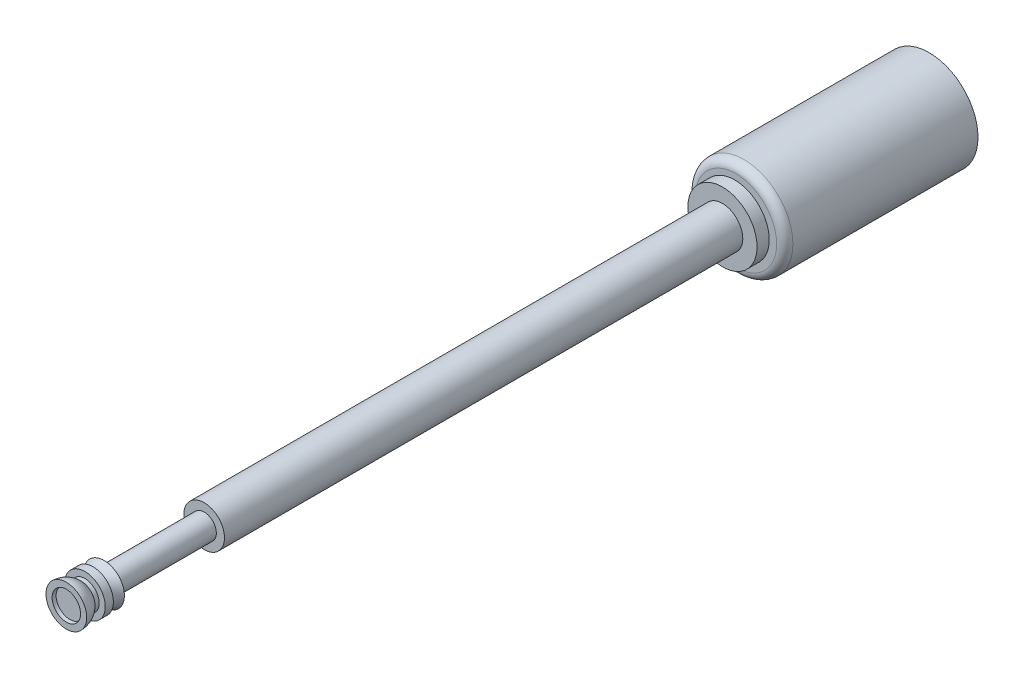
ISO-10303-21;
HEADER;
FILE_DESCRIPTION(('STEP AP214'),'2;1');
FILE_NAME('part.step','',(''),(''),'','','');
FILE_SCHEMA(('AUTOMOTIVE_DESIGN { 1 0 10303 214 1 1 1 1 }'));
ENDSEC;
DATA;
#1=APPLICATION_CONTEXT('core data for automotive mechanical design processes');
#2=APPLICATION_PROTOCOL_DEFINITION('international standard','automotive_design',2000,#1);
#3=PRODUCT_CONTEXT('',#1,'mechanical');
#4=PRODUCT('Part','Part','',(#3));
#5=PRODUCT_RELATED_PRODUCT_CATEGORY('part','',(#4));
#6=PRODUCT_DEFINITION_FORMATION('','',#4);
#7=PRODUCT_DEFINITION_CONTEXT('part definition',#1,'design');
#8=PRODUCT_DEFINITION('design','',#6,#7);
#9=PRODUCT_DEFINITION_SHAPE('','',#8);
#10=(LENGTH_UNIT() NAMED_UNIT(*) SI_UNIT(.MILLI.,.METRE.));
#11=(NAMED_UNIT(*) PLANE_ANGLE_UNIT() SI_UNIT($,.RADIAN.));
#12=(NAMED_UNIT(*) SI_UNIT($,.STERADIAN.) SOLID_ANGLE_UNIT());
#13=UNCERTAINTY_MEASURE_WITH_UNIT(LENGTH_MEASURE(1.E-05),#10,'distance_accuracy_value','');
#14=(GEOMETRIC_REPRESENTATION_CONTEXT(3) GLOBAL_UNCERTAINTY_ASSIGNED_CONTEXT((#13)) GLOBAL_UNIT_ASSIGNED_CONTEXT((#10,
#11,#12)) REPRESENTATION_CONTEXT('',''));
#15=CARTESIAN_POINT('',(0.,0.,0.));
#16=DIRECTION('',(0.,0.,1.));
#17=DIRECTION('',(1.,0.,0.));
#18=AXIS2_PLACEMENT_3D('',#15,#16,#17);
#19=CARTESIAN_POINT('',(0.,0.,16.4275));
#20=DIRECTION('',(0.,0.,-1.));
#21=DIRECTION('',(-1.,0.,0.));
#22=AXIS2_PLACEMENT_3D('',#19,#20,#21);
#23=SPHERICAL_SURFACE('',#22,0.35);
#24=CARTESIAN_POINT('',(0.,0.,16.4275));
#25=DIRECTION('',(0.,0.,-1.));
#26=DIRECTION('',(-1.,0.,0.));
#27=AXIS2_PLACEMENT_3D('',#24,#25,#26);
#28=CIRCLE('',#27,0.35);
#29=CARTESIAN_POINT('',(-0.35,0.,16.4275));
#30=VERTEX_POINT('',#29);
#31=EDGE_CURVE('E87',#30,#30,#28,.T.);
#32=ORIENTED_EDGE('',*,*,#31,.F.);
#33=EDGE_LOOP('',(#32));
#34=FACE_BOUND('',#33,.T.);
#35=CARTESIAN_POINT('',(0.,0.,16.34));
#36=DIRECTION('',(0.,0.,-1.));
#37=DIRECTION('',(-1.,0.,0.));
#38=AXIS2_PLACEMENT_3D('',#35,#36,#37);
#39=CIRCLE('',#38,0.338886042793148);
#40=CARTESIAN_POINT('',(-0.338886042793148,0.,16.34));
#41=VERTEX_POINT('',#40);
#42=EDGE_CURVE('E10',#41,#41,#39,.F.);
#43=ORIENTED_EDGE('',*,*,#42,.F.);
#44=EDGE_LOOP('',(#43));
#45=FACE_BOUND('',#44,.T.);
#46=ADVANCED_FACE('F36',(#34,#45),#23,.F.);
#47=CARTESIAN_POINT('',(0.,0.,15.8012648671457));
#48=DIRECTION('',(0.,0.,-1.));
#49=DIRECTION('',(-1.,0.,0.));
#50=AXIS2_PLACEMENT_3D('',#47,#48,#49);
#51=TOROIDAL_SURFACE('',#50,0.899048217416964,0.499999999999999);
#52=CARTESIAN_POINT('',(0.,0.,15.5));
#53=DIRECTION('',(0.,0.,-1.));
#54=DIRECTION('',(-1.,0.,0.));
#55=AXIS2_PLACEMENT_3D('',#52,#53,#54);
#56=CIRCLE('',#55,0.5);
#57=CARTESIAN_POINT('',(-0.5,0.,15.5));
#58=VERTEX_POINT('',#57);
#59=EDGE_CURVE('E90',#58,#58,#56,.F.);
#60=ORIENTED_EDGE('',*,*,#59,.T.);
#61=EDGE_LOOP('',(#60));
#62=FACE_BOUND('',#61,.T.);
#63=CARTESIAN_POINT('',(0.,0.,15.7704285785729));
#64=DIRECTION('',(0.,0.,-1.));
#65=DIRECTION('',(-1.,0.,0.));
#66=AXIS2_PLACEMENT_3D('',#63,#64,#65);
#67=CIRCLE('',#66,0.4);
#68=CARTESIAN_POINT('',(-0.4,0.,15.7704285785729));
#69=VERTEX_POINT('',#68);
#70=EDGE_CURVE('E67',#69,#69,#67,.T.);
#71=ORIENTED_EDGE('',*,*,#70,.T.);
#72=EDGE_LOOP('',(#71));
#73=FACE_BOUND('',#72,.T.);
#74=ADVANCED_FACE('F113',(#62,#73),#51,.F.);
#75=CARTESIAN_POINT('',(0.5,0.,15.7704285785729));
#76=DIRECTION('',(0.,0.,1.));
#77=DIRECTION('',(1.,0.,0.));
#78=AXIS2_PLACEMENT_3D('',#75,#76,#77);
#79=PLANE('',#78);
#80=ORIENTED_EDGE('',*,*,#70,.F.);
#81=EDGE_LOOP('',(#80));
#82=FACE_BOUND('',#81,.T.);
#83=CARTESIAN_POINT('',(0.,0.,15.7704285785729));
#84=DIRECTION('',(0.,0.,-1.));
#85=DIRECTION('',(-1.,0.,0.));
#86=AXIS2_PLACEMENT_3D('',#83,#84,#85);
#87=CIRCLE('',#86,0.5);
#88=CARTESIAN_POINT('',(-0.5,0.,15.7704285785729));
#89=VERTEX_POINT('',#88);
#90=EDGE_CURVE('E72',#89,#89,#87,.T.);
#91=ORIENTED_EDGE('',*,*,#90,.T.);
#92=EDGE_LOOP('',(#91));
#93=FACE_BOUND('',#92,.T.);
#94=ADVANCED_FACE('F116',(#82,#93),#79,.F.);
#95=CARTESIAN_POINT('',(0.,0.,15.5));
#96=DIRECTION('',(0.,0.,-1.));
#97=DIRECTION('',(-1.,0.,0.));
#98=AXIS2_PLACEMENT_3D('',#95,#96,#97);
#99=CYLINDRICAL_SURFACE('',#98,0.5);
#100=ORIENTED_EDGE('',*,*,#90,.F.);
#101=EDGE_LOOP('',(#100));
#102=FACE_BOUND('',#101,.T.);
#103=CARTESIAN_POINT('',(0.,0.,15.9704285785729));
#104=DIRECTION('',(0.,0.,-1.));
#105=DIRECTION('',(-1.,0.,0.));
#106=AXIS2_PLACEMENT_3D('',#103,#104,#105);
#107=CIRCLE('',#106,0.5);
#108=CARTESIAN_POINT('',(-0.5,0.,15.9704285785729));
#109=VERTEX_POINT('',#108);
#110=EDGE_CURVE('E75',#109,#109,#107,.T.);
#111=ORIENTED_EDGE('',*,*,#110,.T.);
#112=EDGE_LOOP('',(#111));
#113=FACE_BOUND('',#112,.T.);
#114=ADVANCED_FACE('F122',(#102,#113),#99,.T.);
#115=CARTESIAN_POINT('',(0.35,0.,15.9704285785729));
#116=DIRECTION('',(0.,0.,-1.));
#117=DIRECTION('',(-1.,0.,0.));
#118=AXIS2_PLACEMENT_3D('',#115,#116,#117);
#119=PLANE('',#118);
#120=ORIENTED_EDGE('',*,*,#110,.F.);
#121=EDGE_LOOP('',(#120));
#122=FACE_BOUND('',#121,.T.);
#123=CARTESIAN_POINT('',(0.,0.,15.9704285785729));
#124=DIRECTION('',(0.,0.,-1.));
#125=DIRECTION('',(-1.,0.,0.));
#126=AXIS2_PLACEMENT_3D('',#123,#124,#125);
#127=CIRCLE('',#126,0.35);
#128=CARTESIAN_POINT('',(-0.35,0.,15.9704285785729));
#129=VERTEX_POINT('',#128);
#130=EDGE_CURVE('E78',#129,#129,#127,.T.);
#131=ORIENTED_EDGE('',*,*,#130,.T.);
#132=EDGE_LOOP('',(#131));
#133=FACE_BOUND('',#132,.T.);
#134=ADVANCED_FACE('F128',(#122,#133),#119,.F.);
#135=CARTESIAN_POINT('',(0.,0.,15.5));
#136=DIRECTION('',(0.,0.,-1.));
#137=DIRECTION('',(-1.,0.,0.));
#138=AXIS2_PLACEMENT_3D('',#135,#136,#137);
#139=CYLINDRICAL_SURFACE('',#138,0.35);
#140=ORIENTED_EDGE('',*,*,#130,.F.);
#141=EDGE_LOOP('',(#140));
#142=FACE_BOUND('',#141,.T.);
#143=CARTESIAN_POINT('',(0.,0.,16.0704285785729));
#144=DIRECTION('',(0.,0.,-1.));
#145=DIRECTION('',(-1.,0.,0.));
#146=AXIS2_PLACEMENT_3D('',#143,#144,#145);
#147=CIRCLE('',#146,0.35);
#148=CARTESIAN_POINT('',(-0.35,0.,16.0704285785729));
#149=VERTEX_POINT('',#148);
#150=EDGE_CURVE('E81',#149,#149,#147,.T.);
#151=ORIENTED_EDGE('',*,*,#150,.T.);
#152=EDGE_LOOP('',(#151));
#153=FACE_BOUND('',#152,.T.);
#154=ADVANCED_FACE('F134',(#142,#153),#139,.T.);
#155=CARTESIAN_POINT('',(0.,0.,16.4275));
#156=DIRECTION('',(0.,0.,-1.));
#157=DIRECTION('',(1.,0.,0.));
#158=AXIS2_PLACEMENT_3D('',#155,#156,#157);
#159=SPHERICAL_SURFACE('',#158,0.5);
#160=ORIENTED_EDGE('',*,*,#150,.F.);
#161=EDGE_LOOP('',(#160));
#162=FACE_BOUND('',#161,.T.);
#163=CARTESIAN_POINT('',(0.,0.,16.4275));
#164=DIRECTION('',(0.,0.,-1.));
#165=DIRECTION('',(-1.,0.,0.));
#166=AXIS2_PLACEMENT_3D('',#163,#164,#165);
#167=CIRCLE('',#166,0.5);
#168=CARTESIAN_POINT('',(-0.5,0.,16.4275));
#169=VERTEX_POINT('',#168);
#170=EDGE_CURVE('E84',#169,#169,#167,.T.);
#171=ORIENTED_EDGE('',*,*,#170,.T.);
#172=EDGE_LOOP('',(#171));
#173=FACE_BOUND('',#172,.T.);
#174=ADVANCED_FACE('F140',(#162,#173),#159,.T.);
#175=CARTESIAN_POINT('',(0.35,0.,16.4275));
#176=DIRECTION('',(0.,0.,-1.));
#177=DIRECTION('',(-1.,0.,0.));
#178=AXIS2_PLACEMENT_3D('',#175,#176,#177);
#179=PLANE('',#178);
#180=ORIENTED_EDGE('',*,*,#170,.F.);
#181=EDGE_LOOP('',(#180));
#182=FACE_BOUND('',#181,.T.);
#183=ORIENTED_EDGE('',*,*,#31,.T.);
#184=EDGE_LOOP('',(#183));
#185=FACE_BOUND('',#184,.T.);
#186=ADVANCED_FACE('F146',(#182,#185),#179,.F.);
#187=CARTESIAN_POINT('',(0.000546653475643766,0.,16.34));
#188=DIRECTION('',(0.,0.,-1.));
#189=DIRECTION('',(-1.,0.,0.));
#190=AXIS2_PLACEMENT_3D('',#187,#188,#189);
#191=PLANE('',#190);
#192=ORIENTED_EDGE('',*,*,#42,.T.);
#193=EDGE_LOOP('',(#192));
#194=FACE_BOUND('',#193,.T.);
#195=ADVANCED_FACE('F109',(#194),#191,.F.);
#196=CARTESIAN_POINT('',(-0.3,0.,15.5));
#197=DIRECTION('',(0.,0.,1.));
#198=DIRECTION('',(1.,0.,0.));
#199=AXIS2_PLACEMENT_3D('',#196,#197,#198);
#200=PLANE('',#199);
#201=CARTESIAN_POINT('',(0.,0.,15.5));
#202=DIRECTION('',(0.,0.,-1.));
#203=DIRECTION('',(-1.,0.,0.));
#204=AXIS2_PLACEMENT_3D('',#201,#202,#203);
#205=CIRCLE('',#204,0.3);
#206=CARTESIAN_POINT('',(-0.3,0.,15.5));
#207=VERTEX_POINT('',#206);
#208=EDGE_CURVE('E99',#207,#207,#205,.T.);
#209=ORIENTED_EDGE('',*,*,#208,.F.);
#210=EDGE_LOOP('',(#209));
#211=FACE_BOUND('',#210,.T.);
#212=ORIENTED_EDGE('',*,*,#59,.F.);
#213=EDGE_LOOP('',(#212));
#214=FACE_BOUND('',#213,.T.);
#215=ADVANCED_FACE('F105',(#211,#214),#200,.F.);
#216=CARTESIAN_POINT('',(-0.3,0.,13.04));
#217=DIRECTION('',(0.,0.,-1.));
#218=DIRECTION('',(-1.,0.,0.));
#219=AXIS2_PLACEMENT_3D('',#216,#217,#218);
#220=PLANE('',#219);
#221=CARTESIAN_POINT('',(0.,0.,13.04));
#222=DIRECTION('',(0.,0.,-1.));
#223=DIRECTION('',(-1.,0.,0.));
#224=AXIS2_PLACEMENT_3D('',#221,#222,#223);
#225=CIRCLE('',#224,0.3);
#226=CARTESIAN_POINT('',(-0.3,0.,13.04));
#227=VERTEX_POINT('',#226);
#228=EDGE_CURVE('E96',#227,#227,#225,.T.);
#229=ORIENTED_EDGE('',*,*,#228,.T.);
#230=EDGE_LOOP('',(#229));
#231=FACE_BOUND('',#230,.T.);
#232=CARTESIAN_POINT('',(0.,0.,13.04));
#233=DIRECTION('',(0.,0.,-1.));
#234=DIRECTION('',(-1.,0.,0.));
#235=AXIS2_PLACEMENT_3D('',#232,#233,#234);
#236=CIRCLE('',#235,0.5);
#237=CARTESIAN_POINT('',(-0.5,0.,13.04));
#238=VERTEX_POINT('',#237);
#239=EDGE_CURVE('E93',#238,#238,#236,.T.);
#240=ORIENTED_EDGE('',*,*,#239,.F.);
#241=EDGE_LOOP('',(#240));
#242=FACE_BOUND('',#241,.T.);
#243=ADVANCED_FACE('F108',(#231,#242),#220,.F.);
#244=CARTESIAN_POINT('',(0.,0.,15.5));
#245=DIRECTION('',(0.,0.,-1.));
#246=DIRECTION('',(-1.,0.,0.));
#247=AXIS2_PLACEMENT_3D('',#244,#245,#246);
#248=CYLINDRICAL_SURFACE('',#247,0.3);
#249=ORIENTED_EDGE('',*,*,#228,.F.);
#250=EDGE_LOOP('',(#249));
#251=FACE_BOUND('',#250,.T.);
#252=ORIENTED_EDGE('',*,*,#208,.T.);
#253=EDGE_LOOP('',(#252));
#254=FACE_BOUND('',#253,.T.);
#255=ADVANCED_FACE('F103',(#251,#254),#248,.T.);
#256=CARTESIAN_POINT('',(0.,0.,-4.75));
#257=DIRECTION('',(0.,0.,1.));
#258=DIRECTION('',(1.,0.,0.));
#259=AXIS2_PLACEMENT_3D('',#256,#257,#258);
#260=PLANE('',#259);
#261=CARTESIAN_POINT('',(0.031563249051036,0.,-4.75));
#262=DIRECTION('',(0.,0.,1.));
#263=DIRECTION('',(1.,0.,0.));
#264=AXIS2_PLACEMENT_3D('',#261,#262,#263);
#265=CIRCLE('',#264,1.2);
#266=CARTESIAN_POINT('',(1.23156324905104,0.,-4.75));
#267=VERTEX_POINT('',#266);
#268=EDGE_CURVE('E57',#267,#267,#265,.T.);
#269=ORIENTED_EDGE('',*,*,#268,.F.);
#270=EDGE_LOOP('',(#269));
#271=FACE_BOUND('',#270,.T.);
#272=ADVANCED_FACE('F197',(#271),#260,.F.);
#273=CARTESIAN_POINT('',(0.031563249051036,0.,-4.75));
#274=DIRECTION('',(0.,0.,1.));
#275=DIRECTION('',(1.,0.,0.));
#276=AXIS2_PLACEMENT_3D('',#273,#274,#275);
#277=CYLINDRICAL_SURFACE('',#276,1.2);
#278=CARTESIAN_POINT('',(0.031563249051036,0.,-0.2));
#279=DIRECTION('',(0.,0.,1.));
#280=DIRECTION('',(1.,0.,0.));
#281=AXIS2_PLACEMENT_3D('',#278,#279,#280);
#282=CIRCLE('',#281,1.2);
#283=CARTESIAN_POINT('',(1.23156324905104,0.,-0.2));
#284=VERTEX_POINT('',#283);
#285=EDGE_CURVE('E48',#284,#284,#282,.F.);
#286=ORIENTED_EDGE('',*,*,#285,.T.);
#287=EDGE_LOOP('',(#286));
#288=FACE_BOUND('',#287,.T.);
#289=ORIENTED_EDGE('',*,*,#268,.T.);
#290=EDGE_LOOP('',(#289));
#291=FACE_BOUND('',#290,.T.);
#292=ADVANCED_FACE('F204',(#288,#291),#277,.T.);
#293=CARTESIAN_POINT('',(0.031563249051036,0.,-0.2));
#294=DIRECTION('',(0.,0.,1.));
#295=DIRECTION('',(1.,0.,0.));
#296=AXIS2_PLACEMENT_3D('',#293,#294,#295);
#297=TOROIDAL_SURFACE('',#296,1.,0.2);
#298=ORIENTED_EDGE('',*,*,#285,.F.);
#299=EDGE_LOOP('',(#298));
#300=FACE_BOUND('',#299,.T.);
#301=CARTESIAN_POINT('',(0.031563249051036,0.,0.));
#302=DIRECTION('',(0.,0.,1.));
#303=DIRECTION('',(1.,0.,0.));
#304=AXIS2_PLACEMENT_3D('',#301,#302,#303);
#305=CIRCLE('',#304,1.);
#306=CARTESIAN_POINT('',(1.03156324905104,0.,0.));
#307=VERTEX_POINT('',#306);
#308=EDGE_CURVE('E52',#307,#307,#305,.T.);
#309=ORIENTED_EDGE('',*,*,#308,.F.);
#310=EDGE_LOOP('',(#309));
#311=FACE_BOUND('',#310,.T.);
#312=ADVANCED_FACE('F38',(#300,#311),#297,.T.);
#313=CARTESIAN_POINT('',(0.,0.,0.));
#314=DIRECTION('',(0.,0.,1.));
#315=DIRECTION('',(1.,0.,0.));
#316=AXIS2_PLACEMENT_3D('',#313,#314,#315);
#317=PLANE('',#316);
#318=CARTESIAN_POINT('',(0.,0.,0.));
#319=DIRECTION('',(0.,0.,1.));
#320=DIRECTION('',(1.,0.,0.));
#321=AXIS2_PLACEMENT_3D('',#318,#319,#320);
#322=CIRCLE('',#321,0.85);
#323=CARTESIAN_POINT('',(0.85,0.,0.));
#324=VERTEX_POINT('',#323);
#325=EDGE_CURVE('E64',#324,#324,#322,.T.);
#326=ORIENTED_EDGE('',*,*,#325,.F.);
#327=EDGE_LOOP('',(#326));
#328=FACE_BOUND('',#327,.T.);
#329=ORIENTED_EDGE('',*,*,#308,.T.);
#330=EDGE_LOOP('',(#329));
#331=FACE_BOUND('',#330,.T.);
#332=ADVANCED_FACE('F219',(#328,#331),#317,.T.);
#333=CARTESIAN_POINT('',(0.,0.,0.3));
#334=DIRECTION('',(0.,0.,-1.));
#335=DIRECTION('',(-1.,0.,0.));
#336=AXIS2_PLACEMENT_3D('',#333,#334,#335);
#337=CYLINDRICAL_SURFACE('',#336,0.85);
#338=CARTESIAN_POINT('',(0.,0.,0.3));
#339=DIRECTION('',(0.,0.,1.));
#340=DIRECTION('',(1.,0.,0.));
#341=AXIS2_PLACEMENT_3D('',#338,#339,#340);
#342=CIRCLE('',#341,0.85);
#343=CARTESIAN_POINT('',(0.85,0.,0.3));
#344=VERTEX_POINT('',#343);
#345=EDGE_CURVE('E58',#344,#344,#342,.T.);
#346=ORIENTED_EDGE('',*,*,#345,.F.);
#347=EDGE_LOOP('',(#346));
#348=FACE_BOUND('',#347,.T.);
#349=ORIENTED_EDGE('',*,*,#325,.T.);
#350=EDGE_LOOP('',(#349));
#351=FACE_BOUND('',#350,.T.);
#352=ADVANCED_FACE('F226',(#348,#351),#337,.T.);
#353=CARTESIAN_POINT('',(0.,0.,0.3));
#354=DIRECTION('',(0.,0.,1.));
#355=DIRECTION('',(1.,0.,0.));
#356=AXIS2_PLACEMENT_3D('',#353,#354,#355);
#357=PLANE('',#356);
#358=CARTESIAN_POINT('',(0.,0.,0.3));
#359=DIRECTION('',(0.,0.,1.));
#360=DIRECTION('',(1.,0.,0.));
#361=AXIS2_PLACEMENT_3D('',#358,#359,#360);
#362=CIRCLE('',#361,0.5);
#363=CARTESIAN_POINT('',(0.5,0.,0.3));
#364=VERTEX_POINT('',#363);
#365=EDGE_CURVE('E55',#364,#364,#362,.T.);
#366=ORIENTED_EDGE('',*,*,#365,.F.);
#367=EDGE_LOOP('',(#366));
#368=FACE_BOUND('',#367,.T.);
#369=ORIENTED_EDGE('',*,*,#345,.T.);
#370=EDGE_LOOP('',(#369));
#371=FACE_BOUND('',#370,.T.);
#372=ADVANCED_FACE('F234',(#368,#371),#357,.T.);
#373=CARTESIAN_POINT('',(0.,0.,15.5));
#374=DIRECTION('',(0.,0.,-1.));
#375=DIRECTION('',(-1.,0.,0.));
#376=AXIS2_PLACEMENT_3D('',#373,#374,#375);
#377=CYLINDRICAL_SURFACE('',#376,0.5);
#378=ORIENTED_EDGE('',*,*,#239,.T.);
#379=EDGE_LOOP('',(#378));
#380=FACE_BOUND('',#379,.T.);
#381=ORIENTED_EDGE('',*,*,#365,.T.);
#382=EDGE_LOOP('',(#381));
#383=FACE_BOUND('',#382,.T.);
#384=ADVANCED_FACE('F241',(#380,#383),#377,.T.);
#385=CLOSED_SHELL('',(#46,#74,#94,#114,#134,#154,#174,#186,#195,#215,#243,#255,#272,#292,#312,
#332,#352,#372,#384));
#386=CARTESIAN_POINT('',(0.000546653475643746,0.,16.24));
#387=DIRECTION('',(0.,0.,1.));
#388=DIRECTION('',(1.,0.,0.));
#389=AXIS2_PLACEMENT_3D('',#386,#387,#388);
#390=PLANE('',#389);
#391=CARTESIAN_POINT('',(0.,0.,16.24));
#392=DIRECTION('',(0.,0.,1.));
#393=DIRECTION('',(1.,0.,0.));
#394=AXIS2_PLACEMENT_3D('',#391,#392,#393);
#395=CIRCLE('',#394,0.29553976043842);
#396=CARTESIAN_POINT('',(0.29553976043842,0.,16.24));
#397=VERTEX_POINT('',#396);
#398=EDGE_CURVE('E44',#397,#397,#395,.F.);
#399=ORIENTED_EDGE('',*,*,#398,.T.);
#400=EDGE_LOOP('',(#399));
#401=FACE_BOUND('',#400,.T.);
#402=ADVANCED_FACE('F163',(#401),#390,.F.);
#403=ORIENTED_EDGE('',*,*,#398,.F.);
#404=EDGE_LOOP('',(#403));
#405=FACE_BOUND('',#404,.T.);
#406=ADVANCED_FACE('F158',(#405),#23,.F.);
#407=CLOSED_SHELL('',(#402,#406));
#408=ORIENTED_CLOSED_SHELL('',*,#407,.T.);
#409=BREP_WITH_VOIDS('B2',#385,(#408));
#410=ADVANCED_BREP_SHAPE_REPRESENTATION('',(#18,#409),#14);
#411=SHAPE_DEFINITION_REPRESENTATION(#9,#410);
ENDSEC;
END-ISO-10303-21;
